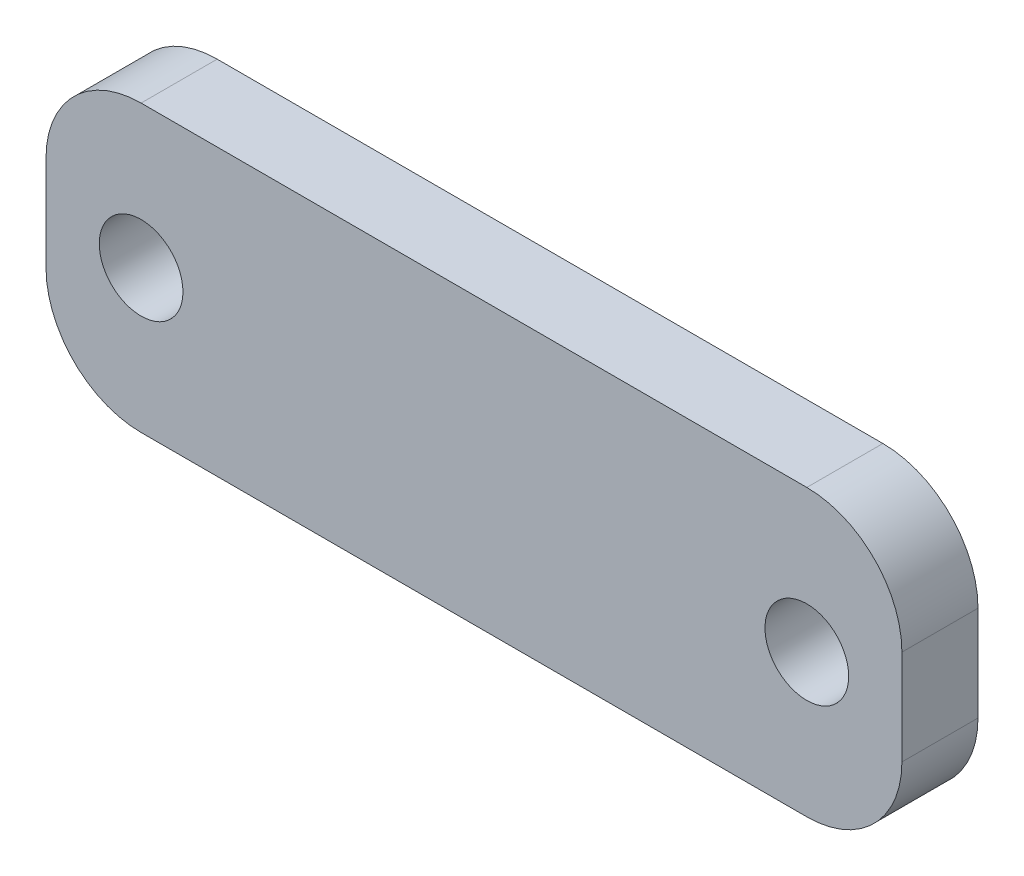
ISO-10303-21;
HEADER;
FILE_DESCRIPTION(('STEP AP214'),'2;1');
FILE_NAME('part.step','',(''),(''),'','','');
FILE_SCHEMA(('AUTOMOTIVE_DESIGN { 1 0 10303 214 1 1 1 1 }'));
ENDSEC;
DATA;
#1=APPLICATION_CONTEXT('core data for automotive mechanical design processes');
#2=APPLICATION_PROTOCOL_DEFINITION('international standard','automotive_design',2000,#1);
#3=PRODUCT_CONTEXT('',#1,'mechanical');
#4=PRODUCT('Part','Part','',(#3));
#5=PRODUCT_RELATED_PRODUCT_CATEGORY('part','',(#4));
#6=PRODUCT_DEFINITION_FORMATION('','',#4);
#7=PRODUCT_DEFINITION_CONTEXT('part definition',#1,'design');
#8=PRODUCT_DEFINITION('design','',#6,#7);
#9=PRODUCT_DEFINITION_SHAPE('','',#8);
#10=(LENGTH_UNIT() NAMED_UNIT(*) SI_UNIT(.MILLI.,.METRE.));
#11=(NAMED_UNIT(*) PLANE_ANGLE_UNIT() SI_UNIT($,.RADIAN.));
#12=(NAMED_UNIT(*) SI_UNIT($,.STERADIAN.) SOLID_ANGLE_UNIT());
#13=UNCERTAINTY_MEASURE_WITH_UNIT(LENGTH_MEASURE(1.E-05),#10,'distance_accuracy_value','');
#14=(GEOMETRIC_REPRESENTATION_CONTEXT(3) GLOBAL_UNCERTAINTY_ASSIGNED_CONTEXT((#13)) GLOBAL_UNIT_ASSIGNED_CONTEXT((#10,
#11,#12)) REPRESENTATION_CONTEXT('',''));
#15=CARTESIAN_POINT('',(0.,0.,0.));
#16=DIRECTION('',(0.,0.,1.));
#17=DIRECTION('',(1.,0.,0.));
#18=AXIS2_PLACEMENT_3D('',#15,#16,#17);
#19=CARTESIAN_POINT('',(0.,0.,4.));
#20=DIRECTION('',(0.,0.,-1.));
#21=DIRECTION('',(-1.,0.,0.));
#22=AXIS2_PLACEMENT_3D('',#19,#20,#21);
#23=PLANE('',#22);
#24=DIRECTION('',(0.,-1.,0.));
#25=VECTOR('',#24,1.);
#26=CARTESIAN_POINT('',(0.,0.,4.));
#27=LINE('',#26,#25);
#28=CARTESIAN_POINT('',(0.,10.,4.));
#29=VERTEX_POINT('',#28);
#30=CARTESIAN_POINT('',(0.,5.,4.));
#31=VERTEX_POINT('',#30);
#32=EDGE_CURVE('E138',#29,#31,#27,.T.);
#33=ORIENTED_EDGE('',*,*,#32,.T.);
#34=CARTESIAN_POINT('',(5.,5.,4.));
#35=DIRECTION('',(0.,0.,-1.));
#36=DIRECTION('',(-1.,0.,0.));
#37=AXIS2_PLACEMENT_3D('',#34,#35,#36);
#38=CIRCLE('',#37,5.);
#39=CARTESIAN_POINT('',(5.00000000000001,0.,4.));
#40=VERTEX_POINT('',#39);
#41=EDGE_CURVE('E156',#31,#40,#38,.F.);
#42=ORIENTED_EDGE('',*,*,#41,.T.);
#43=DIRECTION('',(1.,0.,0.));
#44=VECTOR('',#43,1.);
#45=CARTESIAN_POINT('',(45.,0.,4.));
#46=LINE('',#45,#44);
#47=CARTESIAN_POINT('',(40.,0.,4.));
#48=VERTEX_POINT('',#47);
#49=EDGE_CURVE('E120',#40,#48,#46,.T.);
#50=ORIENTED_EDGE('',*,*,#49,.T.);
#51=CARTESIAN_POINT('',(40.,5.,4.));
#52=DIRECTION('',(0.,0.,-1.));
#53=DIRECTION('',(-1.,0.,0.));
#54=AXIS2_PLACEMENT_3D('',#51,#52,#53);
#55=CIRCLE('',#54,5.);
#56=CARTESIAN_POINT('',(45.,5.,4.));
#57=VERTEX_POINT('',#56);
#58=EDGE_CURVE('E152',#48,#57,#55,.F.);
#59=ORIENTED_EDGE('',*,*,#58,.T.);
#60=DIRECTION('',(0.,1.,0.));
#61=VECTOR('',#60,1.);
#62=CARTESIAN_POINT('',(45.,15.,4.));
#63=LINE('',#62,#61);
#64=CARTESIAN_POINT('',(45.,10.,4.));
#65=VERTEX_POINT('',#64);
#66=EDGE_CURVE('E165',#57,#65,#63,.T.);
#67=ORIENTED_EDGE('',*,*,#66,.T.);
#68=CARTESIAN_POINT('',(40.,10.,4.));
#69=DIRECTION('',(0.,0.,-1.));
#70=DIRECTION('',(-1.,0.,0.));
#71=AXIS2_PLACEMENT_3D('',#68,#69,#70);
#72=CIRCLE('',#71,5.);
#73=CARTESIAN_POINT('',(40.,15.,4.));
#74=VERTEX_POINT('',#73);
#75=EDGE_CURVE('E55',#65,#74,#72,.F.);
#76=ORIENTED_EDGE('',*,*,#75,.T.);
#77=DIRECTION('',(-1.,0.,0.));
#78=VECTOR('',#77,1.);
#79=CARTESIAN_POINT('',(0.,15.,4.));
#80=LINE('',#79,#78);
#81=CARTESIAN_POINT('',(5.,15.,4.));
#82=VERTEX_POINT('',#81);
#83=EDGE_CURVE('E171',#74,#82,#80,.T.);
#84=ORIENTED_EDGE('',*,*,#83,.T.);
#85=CARTESIAN_POINT('',(5.,10.,4.));
#86=DIRECTION('',(0.,0.,-1.));
#87=DIRECTION('',(-1.,0.,0.));
#88=AXIS2_PLACEMENT_3D('',#85,#86,#87);
#89=CIRCLE('',#88,5.);
#90=EDGE_CURVE('E154',#82,#29,#89,.F.);
#91=ORIENTED_EDGE('',*,*,#90,.T.);
#92=EDGE_LOOP('',(#33,#42,#50,#59,#67,#76,#84,#91));
#93=FACE_BOUND('',#92,.T.);
#94=CARTESIAN_POINT('',(5.,7.5,4.));
#95=DIRECTION('',(0.,0.,1.));
#96=DIRECTION('',(1.,0.,0.));
#97=AXIS2_PLACEMENT_3D('',#94,#95,#96);
#98=CIRCLE('',#97,2.2);
#99=CARTESIAN_POINT('',(7.2,7.5,4.));
#100=VERTEX_POINT('',#99);
#101=EDGE_CURVE('E129',#100,#100,#98,.T.);
#102=ORIENTED_EDGE('',*,*,#101,.F.);
#103=EDGE_LOOP('',(#102));
#104=FACE_BOUND('',#103,.T.);
#105=CARTESIAN_POINT('',(40.,7.5,4.));
#106=DIRECTION('',(0.,0.,1.));
#107=DIRECTION('',(1.,0.,0.));
#108=AXIS2_PLACEMENT_3D('',#105,#106,#107);
#109=CIRCLE('',#108,2.2);
#110=CARTESIAN_POINT('',(42.2,7.5,4.));
#111=VERTEX_POINT('',#110);
#112=EDGE_CURVE('E186',#111,#111,#109,.T.);
#113=ORIENTED_EDGE('',*,*,#112,.F.);
#114=EDGE_LOOP('',(#113));
#115=FACE_BOUND('',#114,.T.);
#116=ADVANCED_FACE('F33',(#93,#104,#115),#23,.F.);
#117=CARTESIAN_POINT('',(0.,0.,0.));
#118=DIRECTION('',(0.,0.,-1.));
#119=DIRECTION('',(-1.,0.,0.));
#120=AXIS2_PLACEMENT_3D('',#117,#118,#119);
#121=PLANE('',#120);
#122=CARTESIAN_POINT('',(5.,7.5,0.));
#123=DIRECTION('',(0.,0.,1.));
#124=DIRECTION('',(1.,0.,0.));
#125=AXIS2_PLACEMENT_3D('',#122,#123,#124);
#126=CIRCLE('',#125,2.2);
#127=CARTESIAN_POINT('',(7.2,7.5,0.));
#128=VERTEX_POINT('',#127);
#129=EDGE_CURVE('E135',#128,#128,#126,.T.);
#130=ORIENTED_EDGE('',*,*,#129,.T.);
#131=EDGE_LOOP('',(#130));
#132=FACE_BOUND('',#131,.T.);
#133=DIRECTION('',(1.,0.,0.));
#134=VECTOR('',#133,1.);
#135=CARTESIAN_POINT('',(45.,0.,0.));
#136=LINE('',#135,#134);
#137=CARTESIAN_POINT('',(5.00000000000001,0.,0.));
#138=VERTEX_POINT('',#137);
#139=CARTESIAN_POINT('',(40.,0.,0.));
#140=VERTEX_POINT('',#139);
#141=EDGE_CURVE('E117',#138,#140,#136,.T.);
#142=ORIENTED_EDGE('',*,*,#141,.F.);
#143=CARTESIAN_POINT('',(5.,5.,0.));
#144=DIRECTION('',(0.,0.,-1.));
#145=DIRECTION('',(-1.,0.,0.));
#146=AXIS2_PLACEMENT_3D('',#143,#144,#145);
#147=CIRCLE('',#146,5.);
#148=CARTESIAN_POINT('',(0.,5.,0.));
#149=VERTEX_POINT('',#148);
#150=EDGE_CURVE('E100',#138,#149,#147,.T.);
#151=ORIENTED_EDGE('',*,*,#150,.T.);
#152=DIRECTION('',(0.,-1.,0.));
#153=VECTOR('',#152,1.);
#154=CARTESIAN_POINT('',(0.,0.,0.));
#155=LINE('',#154,#153);
#156=CARTESIAN_POINT('',(0.,10.,0.));
#157=VERTEX_POINT('',#156);
#158=EDGE_CURVE('E142',#157,#149,#155,.T.);
#159=ORIENTED_EDGE('',*,*,#158,.F.);
#160=CARTESIAN_POINT('',(5.,10.,0.));
#161=DIRECTION('',(0.,0.,-1.));
#162=DIRECTION('',(-1.,0.,0.));
#163=AXIS2_PLACEMENT_3D('',#160,#161,#162);
#164=CIRCLE('',#163,5.);
#165=CARTESIAN_POINT('',(5.,15.,0.));
#166=VERTEX_POINT('',#165);
#167=EDGE_CURVE('E111',#157,#166,#164,.T.);
#168=ORIENTED_EDGE('',*,*,#167,.T.);
#169=DIRECTION('',(-1.,0.,0.));
#170=VECTOR('',#169,1.);
#171=CARTESIAN_POINT('',(0.,15.,0.));
#172=LINE('',#171,#170);
#173=CARTESIAN_POINT('',(40.,15.,0.));
#174=VERTEX_POINT('',#173);
#175=EDGE_CURVE('E132',#174,#166,#172,.T.);
#176=ORIENTED_EDGE('',*,*,#175,.F.);
#177=CARTESIAN_POINT('',(40.,10.,0.));
#178=DIRECTION('',(0.,0.,-1.));
#179=DIRECTION('',(-1.,0.,0.));
#180=AXIS2_PLACEMENT_3D('',#177,#178,#179);
#181=CIRCLE('',#180,5.);
#182=CARTESIAN_POINT('',(45.,10.,0.));
#183=VERTEX_POINT('',#182);
#184=EDGE_CURVE('E121',#174,#183,#181,.T.);
#185=ORIENTED_EDGE('',*,*,#184,.T.);
#186=DIRECTION('',(0.,1.,0.));
#187=VECTOR('',#186,1.);
#188=CARTESIAN_POINT('',(45.,15.,0.));
#189=LINE('',#188,#187);
#190=CARTESIAN_POINT('',(45.,5.,0.));
#191=VERTEX_POINT('',#190);
#192=EDGE_CURVE('E128',#191,#183,#189,.T.);
#193=ORIENTED_EDGE('',*,*,#192,.F.);
#194=CARTESIAN_POINT('',(40.,5.,0.));
#195=DIRECTION('',(0.,0.,-1.));
#196=DIRECTION('',(-1.,0.,0.));
#197=AXIS2_PLACEMENT_3D('',#194,#195,#196);
#198=CIRCLE('',#197,5.);
#199=EDGE_CURVE('E127',#191,#140,#198,.T.);
#200=ORIENTED_EDGE('',*,*,#199,.T.);
#201=EDGE_LOOP('',(#142,#151,#159,#168,#176,#185,#193,#200));
#202=FACE_BOUND('',#201,.T.);
#203=CARTESIAN_POINT('',(40.,7.5,0.));
#204=DIRECTION('',(0.,0.,1.));
#205=DIRECTION('',(1.,0.,0.));
#206=AXIS2_PLACEMENT_3D('',#203,#204,#205);
#207=CIRCLE('',#206,2.2);
#208=CARTESIAN_POINT('',(42.2,7.5,0.));
#209=VERTEX_POINT('',#208);
#210=EDGE_CURVE('E188',#209,#209,#207,.T.);
#211=ORIENTED_EDGE('',*,*,#210,.T.);
#212=EDGE_LOOP('',(#211));
#213=FACE_BOUND('',#212,.T.);
#214=ADVANCED_FACE('F124',(#132,#202,#213),#121,.T.);
#215=CARTESIAN_POINT('',(45.,0.,4.));
#216=DIRECTION('',(0.,1.,0.));
#217=DIRECTION('',(-1.,0.,0.));
#218=AXIS2_PLACEMENT_3D('',#215,#216,#217);
#219=PLANE('',#218);
#220=ORIENTED_EDGE('',*,*,#49,.F.);
#221=DIRECTION('',(0.,0.,-1.));
#222=VECTOR('',#221,1.);
#223=CARTESIAN_POINT('',(5.,0.,4.));
#224=LINE('',#223,#222);
#225=EDGE_CURVE('E104',#40,#138,#224,.T.);
#226=ORIENTED_EDGE('',*,*,#225,.T.);
#227=ORIENTED_EDGE('',*,*,#141,.T.);
#228=DIRECTION('',(0.,0.,-1.));
#229=VECTOR('',#228,1.);
#230=CARTESIAN_POINT('',(40.,0.,4.));
#231=LINE('',#230,#229);
#232=EDGE_CURVE('E122',#140,#48,#231,.F.);
#233=ORIENTED_EDGE('',*,*,#232,.T.);
#234=EDGE_LOOP('',(#220,#226,#227,#233));
#235=FACE_BOUND('',#234,.T.);
#236=ADVANCED_FACE('F116',(#235),#219,.F.);
#237=CARTESIAN_POINT('',(45.,15.,4.));
#238=DIRECTION('',(-1.,0.,0.));
#239=DIRECTION('',(0.,0.,1.));
#240=AXIS2_PLACEMENT_3D('',#237,#238,#239);
#241=PLANE('',#240);
#242=ORIENTED_EDGE('',*,*,#66,.F.);
#243=DIRECTION('',(0.,0.,-1.));
#244=VECTOR('',#243,1.);
#245=CARTESIAN_POINT('',(45.,5.,4.));
#246=LINE('',#245,#244);
#247=EDGE_CURVE('E11',#57,#191,#246,.T.);
#248=ORIENTED_EDGE('',*,*,#247,.T.);
#249=ORIENTED_EDGE('',*,*,#192,.T.);
#250=DIRECTION('',(0.,0.,-1.));
#251=VECTOR('',#250,1.);
#252=CARTESIAN_POINT('',(45.,10.,4.));
#253=LINE('',#252,#251);
#254=EDGE_CURVE('E41',#183,#65,#253,.F.);
#255=ORIENTED_EDGE('',*,*,#254,.T.);
#256=EDGE_LOOP('',(#242,#248,#249,#255));
#257=FACE_BOUND('',#256,.T.);
#258=ADVANCED_FACE('F164',(#257),#241,.F.);
#259=CARTESIAN_POINT('',(0.,15.,4.));
#260=DIRECTION('',(0.,-1.,0.));
#261=DIRECTION('',(0.,0.,-1.));
#262=AXIS2_PLACEMENT_3D('',#259,#260,#261);
#263=PLANE('',#262);
#264=ORIENTED_EDGE('',*,*,#175,.T.);
#265=DIRECTION('',(0.,0.,-1.));
#266=VECTOR('',#265,1.);
#267=CARTESIAN_POINT('',(5.,15.,4.));
#268=LINE('',#267,#266);
#269=EDGE_CURVE('E48',#166,#82,#268,.F.);
#270=ORIENTED_EDGE('',*,*,#269,.T.);
#271=ORIENTED_EDGE('',*,*,#83,.F.);
#272=DIRECTION('',(0.,0.,-1.));
#273=VECTOR('',#272,1.);
#274=CARTESIAN_POINT('',(40.,15.,4.));
#275=LINE('',#274,#273);
#276=EDGE_CURVE('E158',#74,#174,#275,.T.);
#277=ORIENTED_EDGE('',*,*,#276,.T.);
#278=EDGE_LOOP('',(#264,#270,#271,#277));
#279=FACE_BOUND('',#278,.T.);
#280=ADVANCED_FACE('F175',(#279),#263,.F.);
#281=CARTESIAN_POINT('',(0.,0.,4.));
#282=DIRECTION('',(1.,0.,0.));
#283=DIRECTION('',(0.,0.,-1.));
#284=AXIS2_PLACEMENT_3D('',#281,#282,#283);
#285=PLANE('',#284);
#286=ORIENTED_EDGE('',*,*,#158,.T.);
#287=DIRECTION('',(0.,0.,-1.));
#288=VECTOR('',#287,1.);
#289=CARTESIAN_POINT('',(0.,5.,4.));
#290=LINE('',#289,#288);
#291=EDGE_CURVE('E105',#149,#31,#290,.F.);
#292=ORIENTED_EDGE('',*,*,#291,.T.);
#293=ORIENTED_EDGE('',*,*,#32,.F.);
#294=DIRECTION('',(0.,0.,-1.));
#295=VECTOR('',#294,1.);
#296=CARTESIAN_POINT('',(0.,10.,4.));
#297=LINE('',#296,#295);
#298=EDGE_CURVE('E110',#29,#157,#297,.T.);
#299=ORIENTED_EDGE('',*,*,#298,.T.);
#300=EDGE_LOOP('',(#286,#292,#293,#299));
#301=FACE_BOUND('',#300,.T.);
#302=ADVANCED_FACE('F182',(#301),#285,.F.);
#303=CARTESIAN_POINT('',(5.,7.5,4.));
#304=DIRECTION('',(0.,0.,-1.));
#305=DIRECTION('',(-1.,0.,0.));
#306=AXIS2_PLACEMENT_3D('',#303,#304,#305);
#307=CYLINDRICAL_SURFACE('',#306,2.2);
#308=ORIENTED_EDGE('',*,*,#101,.T.);
#309=EDGE_LOOP('',(#308));
#310=FACE_BOUND('',#309,.T.);
#311=ORIENTED_EDGE('',*,*,#129,.F.);
#312=EDGE_LOOP('',(#311));
#313=FACE_BOUND('',#312,.T.);
#314=ADVANCED_FACE('F205',(#310,#313),#307,.F.);
#315=CARTESIAN_POINT('',(40.,7.5,4.));
#316=DIRECTION('',(0.,0.,-1.));
#317=DIRECTION('',(-1.,0.,0.));
#318=AXIS2_PLACEMENT_3D('',#315,#316,#317);
#319=CYLINDRICAL_SURFACE('',#318,2.2);
#320=ORIENTED_EDGE('',*,*,#112,.T.);
#321=EDGE_LOOP('',(#320));
#322=FACE_BOUND('',#321,.T.);
#323=ORIENTED_EDGE('',*,*,#210,.F.);
#324=EDGE_LOOP('',(#323));
#325=FACE_BOUND('',#324,.T.);
#326=ADVANCED_FACE('F194',(#322,#325),#319,.F.);
#327=CARTESIAN_POINT('',(5.,5.,4.));
#328=DIRECTION('',(0.,0.,-1.));
#329=DIRECTION('',(-1.,0.,0.));
#330=AXIS2_PLACEMENT_3D('',#327,#328,#329);
#331=CYLINDRICAL_SURFACE('',#330,5.);
#332=ORIENTED_EDGE('',*,*,#41,.F.);
#333=ORIENTED_EDGE('',*,*,#291,.F.);
#334=ORIENTED_EDGE('',*,*,#150,.F.);
#335=ORIENTED_EDGE('',*,*,#225,.F.);
#336=EDGE_LOOP('',(#332,#333,#334,#335));
#337=FACE_BOUND('',#336,.T.);
#338=ADVANCED_FACE('F103',(#337),#331,.T.);
#339=CARTESIAN_POINT('',(5.,10.,4.));
#340=DIRECTION('',(0.,0.,-1.));
#341=DIRECTION('',(-1.,0.,0.));
#342=AXIS2_PLACEMENT_3D('',#339,#340,#341);
#343=CYLINDRICAL_SURFACE('',#342,5.);
#344=ORIENTED_EDGE('',*,*,#90,.F.);
#345=ORIENTED_EDGE('',*,*,#269,.F.);
#346=ORIENTED_EDGE('',*,*,#167,.F.);
#347=ORIENTED_EDGE('',*,*,#298,.F.);
#348=EDGE_LOOP('',(#344,#345,#346,#347));
#349=FACE_BOUND('',#348,.T.);
#350=ADVANCED_FACE('F179',(#349),#343,.T.);
#351=CARTESIAN_POINT('',(40.,5.,4.));
#352=DIRECTION('',(0.,0.,-1.));
#353=DIRECTION('',(-1.,0.,0.));
#354=AXIS2_PLACEMENT_3D('',#351,#352,#353);
#355=CYLINDRICAL_SURFACE('',#354,5.);
#356=ORIENTED_EDGE('',*,*,#58,.F.);
#357=ORIENTED_EDGE('',*,*,#232,.F.);
#358=ORIENTED_EDGE('',*,*,#199,.F.);
#359=ORIENTED_EDGE('',*,*,#247,.F.);
#360=EDGE_LOOP('',(#356,#357,#358,#359));
#361=FACE_BOUND('',#360,.T.);
#362=ADVANCED_FACE('F219',(#361),#355,.T.);
#363=CARTESIAN_POINT('',(40.,10.,4.));
#364=DIRECTION('',(0.,0.,-1.));
#365=DIRECTION('',(-1.,0.,0.));
#366=AXIS2_PLACEMENT_3D('',#363,#364,#365);
#367=CYLINDRICAL_SURFACE('',#366,5.);
#368=ORIENTED_EDGE('',*,*,#75,.F.);
#369=ORIENTED_EDGE('',*,*,#254,.F.);
#370=ORIENTED_EDGE('',*,*,#184,.F.);
#371=ORIENTED_EDGE('',*,*,#276,.F.);
#372=EDGE_LOOP('',(#368,#369,#370,#371));
#373=FACE_BOUND('',#372,.T.);
#374=ADVANCED_FACE('F35',(#373),#367,.T.);
#375=CLOSED_SHELL('',(#116,#214,#236,#258,#280,#302,#314,#326,#338,#350,#362,#374));
#376=MANIFOLD_SOLID_BREP('B2',#375);
#377=ADVANCED_BREP_SHAPE_REPRESENTATION('',(#18,#376),#14);
#378=SHAPE_DEFINITION_REPRESENTATION(#9,#377);
ENDSEC;
END-ISO-10303-21;
